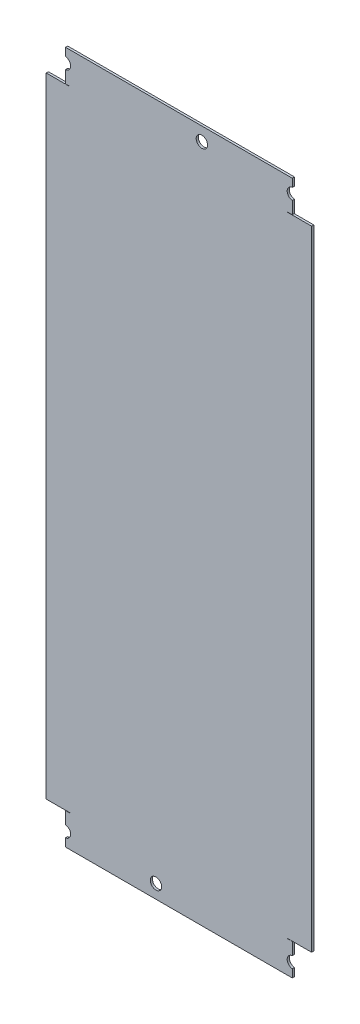
ISO-10303-21;
HEADER;
FILE_DESCRIPTION(('STEP AP214'),'2;1');
FILE_NAME('part.step','',(''),(''),'','','');
FILE_SCHEMA(('AUTOMOTIVE_DESIGN { 1 0 10303 214 1 1 1 1 }'));
ENDSEC;
DATA;
#1=APPLICATION_CONTEXT('core data for automotive mechanical design processes');
#2=APPLICATION_PROTOCOL_DEFINITION('international standard','automotive_design',2000,#1);
#3=PRODUCT_CONTEXT('',#1,'mechanical');
#4=PRODUCT('Part','Part','',(#3));
#5=PRODUCT_RELATED_PRODUCT_CATEGORY('part','',(#4));
#6=PRODUCT_DEFINITION_FORMATION('','',#4);
#7=PRODUCT_DEFINITION_CONTEXT('part definition',#1,'design');
#8=PRODUCT_DEFINITION('design','',#6,#7);
#9=PRODUCT_DEFINITION_SHAPE('','',#8);
#10=(LENGTH_UNIT() NAMED_UNIT(*) SI_UNIT(.MILLI.,.METRE.));
#11=(NAMED_UNIT(*) PLANE_ANGLE_UNIT() SI_UNIT($,.RADIAN.));
#12=(NAMED_UNIT(*) SI_UNIT($,.STERADIAN.) SOLID_ANGLE_UNIT());
#13=UNCERTAINTY_MEASURE_WITH_UNIT(LENGTH_MEASURE(1.E-05),#10,'distance_accuracy_value','');
#14=(GEOMETRIC_REPRESENTATION_CONTEXT(3) GLOBAL_UNCERTAINTY_ASSIGNED_CONTEXT((#13)) GLOBAL_UNIT_ASSIGNED_CONTEXT((#10,
#11,#12)) REPRESENTATION_CONTEXT('',''));
#15=CARTESIAN_POINT('',(0.,0.,0.));
#16=DIRECTION('',(0.,0.,1.));
#17=DIRECTION('',(1.,0.,0.));
#18=AXIS2_PLACEMENT_3D('',#15,#16,#17);
#19=CARTESIAN_POINT('',(0.,0.,-1.524));
#20=DIRECTION('',(0.,0.,-1.));
#21=DIRECTION('',(-1.,0.,0.));
#22=AXIS2_PLACEMENT_3D('',#19,#20,#21);
#23=PLANE('',#22);
#24=CARTESIAN_POINT('',(-16.002,-231.775,-1.524));
#25=DIRECTION('',(0.,0.,1.));
#26=DIRECTION('',(1.,0.,0.));
#27=AXIS2_PLACEMENT_3D('',#24,#25,#26);
#28=CIRCLE('',#27,3.96240000000002);
#29=CARTESIAN_POINT('',(-12.0396,-231.775,-1.524));
#30=VERTEX_POINT('',#29);
#31=EDGE_CURVE('E507',#30,#30,#28,.T.);
#32=ORIENTED_EDGE('',*,*,#31,.T.);
#33=EDGE_LOOP('',(#32));
#34=FACE_BOUND('',#33,.T.);
#35=CARTESIAN_POINT('',(16.002,231.775,-1.524));
#36=DIRECTION('',(0.,0.,1.));
#37=DIRECTION('',(1.,0.,0.));
#38=AXIS2_PLACEMENT_3D('',#35,#36,#37);
#39=CIRCLE('',#38,3.96240000000002);
#40=CARTESIAN_POINT('',(19.9644,231.775,-1.524));
#41=VERTEX_POINT('',#40);
#42=EDGE_CURVE('E515',#41,#41,#39,.T.);
#43=ORIENTED_EDGE('',*,*,#42,.T.);
#44=EDGE_LOOP('',(#43));
#45=FACE_BOUND('',#44,.T.);
#46=DIRECTION('',(0.,1.,0.));
#47=VECTOR('',#46,1.);
#48=CARTESIAN_POINT('',(78.994,-241.3,-1.524));
#49=LINE('',#48,#47);
#50=CARTESIAN_POINT('',(78.994,235.716503875426,-1.52400000000055));
#51=VERTEX_POINT('',#50);
#52=CARTESIAN_POINT('',(78.994,241.3,-1.524));
#53=VERTEX_POINT('',#52);
#54=EDGE_CURVE('E529',#51,#53,#49,.T.);
#55=ORIENTED_EDGE('',*,*,#54,.F.);
#56=CARTESIAN_POINT('',(79.4004,231.775,-1.52400000000055));
#57=DIRECTION('',(0.,0.,1.));
#58=DIRECTION('',(1.,0.,0.));
#59=AXIS2_PLACEMENT_3D('',#56,#57,#58);
#60=CIRCLE('',#59,3.96240000000001);
#61=CARTESIAN_POINT('',(78.994,227.833496124574,-1.52400000000055));
#62=VERTEX_POINT('',#61);
#63=EDGE_CURVE('E357',#62,#51,#60,.F.);
#64=ORIENTED_EDGE('',*,*,#63,.F.);
#65=CARTESIAN_POINT('',(78.994,219.2274,-1.524));
#66=VERTEX_POINT('',#65);
#67=EDGE_CURVE('E530',#66,#62,#49,.T.);
#68=ORIENTED_EDGE('',*,*,#67,.F.);
#69=DIRECTION('',(-1.,0.,0.));
#70=VECTOR('',#69,1.);
#71=CARTESIAN_POINT('',(0.,219.2274,-1.524));
#72=LINE('',#71,#70);
#73=CARTESIAN_POINT('',(75.7936,219.2274,-1.524));
#74=VERTEX_POINT('',#73);
#75=EDGE_CURVE('E503',#66,#74,#72,.T.);
#76=ORIENTED_EDGE('',*,*,#75,.T.);
#77=DIRECTION('',(0.,-1.,0.));
#78=VECTOR('',#77,1.);
#79=CARTESIAN_POINT('',(75.7936,0.,-1.524));
#80=LINE('',#79,#78);
#81=CARTESIAN_POINT('',(75.7936,219.075,-1.524));
#82=VERTEX_POINT('',#81);
#83=EDGE_CURVE('E500',#74,#82,#80,.T.);
#84=ORIENTED_EDGE('',*,*,#83,.T.);
#85=DIRECTION('',(1.,0.,0.));
#86=VECTOR('',#85,1.);
#87=CARTESIAN_POINT('',(0.,219.075,-1.524));
#88=LINE('',#87,#86);
#89=CARTESIAN_POINT('',(92.4429625310124,219.075,-1.52400000000012));
#90=VERTEX_POINT('',#89);
#91=EDGE_CURVE('E497',#82,#90,#88,.T.);
#92=ORIENTED_EDGE('',*,*,#91,.T.);
#93=DIRECTION('',(0.,-1.,0.));
#94=VECTOR('',#93,1.);
#95=CARTESIAN_POINT('',(92.4429625310124,0.,-1.52400000000011));
#96=LINE('',#95,#94);
#97=CARTESIAN_POINT('',(92.4429625310124,-219.075,-1.52400000000009));
#98=VERTEX_POINT('',#97);
#99=EDGE_CURVE('E301',#90,#98,#96,.T.);
#100=ORIENTED_EDGE('',*,*,#99,.T.);
#101=DIRECTION('',(-1.,0.,0.));
#102=VECTOR('',#101,1.);
#103=CARTESIAN_POINT('',(0.,-219.075,-1.524));
#104=LINE('',#103,#102);
#105=CARTESIAN_POINT('',(75.7936,-219.075,-1.524));
#106=VERTEX_POINT('',#105);
#107=EDGE_CURVE('E494',#98,#106,#104,.T.);
#108=ORIENTED_EDGE('',*,*,#107,.T.);
#109=DIRECTION('',(0.,-1.,0.));
#110=VECTOR('',#109,1.);
#111=CARTESIAN_POINT('',(75.7936,0.,-1.524));
#112=LINE('',#111,#110);
#113=CARTESIAN_POINT('',(75.7936,-219.2274,-1.524));
#114=VERTEX_POINT('',#113);
#115=EDGE_CURVE('E491',#106,#114,#112,.T.);
#116=ORIENTED_EDGE('',*,*,#115,.T.);
#117=DIRECTION('',(1.,0.,0.));
#118=VECTOR('',#117,1.);
#119=CARTESIAN_POINT('',(0.,-219.2274,-1.524));
#120=LINE('',#119,#118);
#121=CARTESIAN_POINT('',(78.994,-219.2274,-1.524));
#122=VERTEX_POINT('',#121);
#123=EDGE_CURVE('E455',#114,#122,#120,.T.);
#124=ORIENTED_EDGE('',*,*,#123,.T.);
#125=CARTESIAN_POINT('',(78.994,-227.833496124574,-1.52400000000055));
#126=VERTEX_POINT('',#125);
#127=EDGE_CURVE('E528',#126,#122,#49,.T.);
#128=ORIENTED_EDGE('',*,*,#127,.F.);
#129=CARTESIAN_POINT('',(79.4004000000001,-231.775,-1.52400000000055));
#130=DIRECTION('',(0.,0.,1.));
#131=DIRECTION('',(1.,0.,0.));
#132=AXIS2_PLACEMENT_3D('',#129,#130,#131);
#133=CIRCLE('',#132,3.96240000000001);
#134=CARTESIAN_POINT('',(78.994,-235.716503875426,-1.52400000000055));
#135=VERTEX_POINT('',#134);
#136=EDGE_CURVE('E343',#135,#126,#133,.F.);
#137=ORIENTED_EDGE('',*,*,#136,.F.);
#138=CARTESIAN_POINT('',(78.994,-241.3,-1.524));
#139=VERTEX_POINT('',#138);
#140=EDGE_CURVE('E523',#139,#135,#49,.T.);
#141=ORIENTED_EDGE('',*,*,#140,.F.);
#142=DIRECTION('',(1.,0.,0.));
#143=VECTOR('',#142,1.);
#144=CARTESIAN_POINT('',(-78.994,-241.3,-1.524));
#145=LINE('',#144,#143);
#146=CARTESIAN_POINT('',(-78.994,-241.3,-1.524));
#147=VERTEX_POINT('',#146);
#148=EDGE_CURVE('E539',#147,#139,#145,.T.);
#149=ORIENTED_EDGE('',*,*,#148,.F.);
#150=DIRECTION('',(0.,-1.,0.));
#151=VECTOR('',#150,1.);
#152=CARTESIAN_POINT('',(-78.994,-241.3,-1.524));
#153=LINE('',#152,#151);
#154=CARTESIAN_POINT('',(-78.994,-235.716503875426,-1.52400000000055));
#155=VERTEX_POINT('',#154);
#156=EDGE_CURVE('E534',#155,#147,#153,.T.);
#157=ORIENTED_EDGE('',*,*,#156,.F.);
#158=CARTESIAN_POINT('',(-79.4004,-231.775,-1.52400000000055));
#159=DIRECTION('',(0.,0.,1.));
#160=DIRECTION('',(1.,0.,0.));
#161=AXIS2_PLACEMENT_3D('',#158,#159,#160);
#162=CIRCLE('',#161,3.96240000000001);
#163=CARTESIAN_POINT('',(-78.994,-227.833496124574,-1.52400000000055));
#164=VERTEX_POINT('',#163);
#165=EDGE_CURVE('E330',#155,#164,#162,.T.);
#166=ORIENTED_EDGE('',*,*,#165,.T.);
#167=CARTESIAN_POINT('',(-78.994,-219.2274,-1.524));
#168=VERTEX_POINT('',#167);
#169=EDGE_CURVE('E541',#168,#164,#153,.T.);
#170=ORIENTED_EDGE('',*,*,#169,.F.);
#171=DIRECTION('',(1.,0.,0.));
#172=VECTOR('',#171,1.);
#173=CARTESIAN_POINT('',(0.,-219.2274,-1.524));
#174=LINE('',#173,#172);
#175=CARTESIAN_POINT('',(-75.7936,-219.2274,-1.524));
#176=VERTEX_POINT('',#175);
#177=EDGE_CURVE('E431',#168,#176,#174,.T.);
#178=ORIENTED_EDGE('',*,*,#177,.T.);
#179=DIRECTION('',(0.,1.,0.));
#180=VECTOR('',#179,1.);
#181=CARTESIAN_POINT('',(-75.7936,0.,-1.524));
#182=LINE('',#181,#180);
#183=CARTESIAN_POINT('',(-75.7936,-219.075,-1.524));
#184=VERTEX_POINT('',#183);
#185=EDGE_CURVE('E446',#176,#184,#182,.T.);
#186=ORIENTED_EDGE('',*,*,#185,.T.);
#187=DIRECTION('',(-1.,0.,0.));
#188=VECTOR('',#187,1.);
#189=CARTESIAN_POINT('',(0.,-219.075,-1.524));
#190=LINE('',#189,#188);
#191=CARTESIAN_POINT('',(-92.442962531013,-219.075,-1.52400000000066));
#192=VERTEX_POINT('',#191);
#193=EDGE_CURVE('E443',#184,#192,#190,.T.);
#194=ORIENTED_EDGE('',*,*,#193,.T.);
#195=DIRECTION('',(0.,1.,0.));
#196=VECTOR('',#195,1.);
#197=CARTESIAN_POINT('',(-92.442962531013,0.,-1.52400000000066));
#198=LINE('',#197,#196);
#199=CARTESIAN_POINT('',(-92.442962531013,219.075,-1.52400000000066));
#200=VERTEX_POINT('',#199);
#201=EDGE_CURVE('E317',#192,#200,#198,.T.);
#202=ORIENTED_EDGE('',*,*,#201,.T.);
#203=DIRECTION('',(1.,0.,0.));
#204=VECTOR('',#203,1.);
#205=CARTESIAN_POINT('',(0.,219.075,-1.524));
#206=LINE('',#205,#204);
#207=CARTESIAN_POINT('',(-75.7936,219.075,-1.524));
#208=VERTEX_POINT('',#207);
#209=EDGE_CURVE('E439',#200,#208,#206,.T.);
#210=ORIENTED_EDGE('',*,*,#209,.T.);
#211=DIRECTION('',(0.,1.,0.));
#212=VECTOR('',#211,1.);
#213=CARTESIAN_POINT('',(-75.7936,0.,-1.524));
#214=LINE('',#213,#212);
#215=CARTESIAN_POINT('',(-75.7936,219.2274,-1.524));
#216=VERTEX_POINT('',#215);
#217=EDGE_CURVE('E435',#208,#216,#214,.T.);
#218=ORIENTED_EDGE('',*,*,#217,.T.);
#219=DIRECTION('',(-1.,0.,0.));
#220=VECTOR('',#219,1.);
#221=CARTESIAN_POINT('',(0.,219.2274,-1.524));
#222=LINE('',#221,#220);
#223=CARTESIAN_POINT('',(-78.994,219.2274,-1.524));
#224=VERTEX_POINT('',#223);
#225=EDGE_CURVE('E385',#216,#224,#222,.T.);
#226=ORIENTED_EDGE('',*,*,#225,.T.);
#227=CARTESIAN_POINT('',(-78.994,227.833496124574,-1.52400000000055));
#228=VERTEX_POINT('',#227);
#229=EDGE_CURVE('E540',#228,#224,#153,.T.);
#230=ORIENTED_EDGE('',*,*,#229,.F.);
#231=CARTESIAN_POINT('',(-79.4004,231.775,-1.52400000000055));
#232=DIRECTION('',(0.,0.,1.));
#233=DIRECTION('',(1.,0.,0.));
#234=AXIS2_PLACEMENT_3D('',#231,#232,#233);
#235=CIRCLE('',#234,3.96240000000001);
#236=CARTESIAN_POINT('',(-78.994,235.716503875426,-1.52400000000055));
#237=VERTEX_POINT('',#236);
#238=EDGE_CURVE('E368',#228,#237,#235,.T.);
#239=ORIENTED_EDGE('',*,*,#238,.T.);
#240=CARTESIAN_POINT('',(-78.994,241.3,-1.524));
#241=VERTEX_POINT('',#240);
#242=EDGE_CURVE('E535',#241,#237,#153,.T.);
#243=ORIENTED_EDGE('',*,*,#242,.F.);
#244=DIRECTION('',(-1.,0.,0.));
#245=VECTOR('',#244,1.);
#246=CARTESIAN_POINT('',(-78.994,241.3,-1.524));
#247=LINE('',#246,#245);
#248=EDGE_CURVE('E527',#53,#241,#247,.T.);
#249=ORIENTED_EDGE('',*,*,#248,.F.);
#250=EDGE_LOOP('',(#55,#64,#68,#76,#84,#92,#100,#108,#116,#124,#128,#137,#141,#149,#157,#166,
#170,#178,#186,#194,#202,#210,#218,#226,#230,#239,#243,#249));
#251=FACE_BOUND('',#250,.T.);
#252=ADVANCED_FACE('F93',(#34,#45,#251),#23,.T.);
#253=CARTESIAN_POINT('',(0.,0.,0.));
#254=DIRECTION('',(0.,0.,-1.));
#255=DIRECTION('',(-1.,0.,0.));
#256=AXIS2_PLACEMENT_3D('',#253,#254,#255);
#257=PLANE('',#256);
#258=CARTESIAN_POINT('',(-16.002,-231.775,0.));
#259=DIRECTION('',(0.,0.,1.));
#260=DIRECTION('',(1.,0.,0.));
#261=AXIS2_PLACEMENT_3D('',#258,#259,#260);
#262=CIRCLE('',#261,3.96240000000002);
#263=CARTESIAN_POINT('',(-12.0396,-231.775,0.));
#264=VERTEX_POINT('',#263);
#265=EDGE_CURVE('E506',#264,#264,#262,.T.);
#266=ORIENTED_EDGE('',*,*,#265,.F.);
#267=EDGE_LOOP('',(#266));
#268=FACE_BOUND('',#267,.T.);
#269=CARTESIAN_POINT('',(16.002,231.775,0.));
#270=DIRECTION('',(0.,0.,1.));
#271=DIRECTION('',(1.,0.,0.));
#272=AXIS2_PLACEMENT_3D('',#269,#270,#271);
#273=CIRCLE('',#272,3.96240000000002);
#274=CARTESIAN_POINT('',(19.9644,231.775,0.));
#275=VERTEX_POINT('',#274);
#276=EDGE_CURVE('E511',#275,#275,#273,.T.);
#277=ORIENTED_EDGE('',*,*,#276,.F.);
#278=EDGE_LOOP('',(#277));
#279=FACE_BOUND('',#278,.T.);
#280=CARTESIAN_POINT('',(79.4004,231.775,0.));
#281=DIRECTION('',(0.,0.,1.));
#282=DIRECTION('',(1.,0.,0.));
#283=AXIS2_PLACEMENT_3D('',#280,#281,#282);
#284=CIRCLE('',#283,3.96240000000001);
#285=CARTESIAN_POINT('',(78.994,227.833496124574,0.));
#286=VERTEX_POINT('',#285);
#287=CARTESIAN_POINT('',(78.994,235.716503875426,0.));
#288=VERTEX_POINT('',#287);
#289=EDGE_CURVE('E316',#286,#288,#284,.F.);
#290=ORIENTED_EDGE('',*,*,#289,.T.);
#291=DIRECTION('',(0.,1.,0.));
#292=VECTOR('',#291,1.);
#293=CARTESIAN_POINT('',(78.994,-241.3,0.));
#294=LINE('',#293,#292);
#295=CARTESIAN_POINT('',(78.994,241.3,0.));
#296=VERTEX_POINT('',#295);
#297=EDGE_CURVE('E519',#288,#296,#294,.T.);
#298=ORIENTED_EDGE('',*,*,#297,.T.);
#299=DIRECTION('',(-1.,0.,0.));
#300=VECTOR('',#299,1.);
#301=CARTESIAN_POINT('',(-78.994,241.3,0.));
#302=LINE('',#301,#300);
#303=CARTESIAN_POINT('',(-78.994,241.3,0.));
#304=VERTEX_POINT('',#303);
#305=EDGE_CURVE('E549',#296,#304,#302,.T.);
#306=ORIENTED_EDGE('',*,*,#305,.T.);
#307=DIRECTION('',(0.,-1.,0.));
#308=VECTOR('',#307,1.);
#309=CARTESIAN_POINT('',(-78.994,-241.3,0.));
#310=LINE('',#309,#308);
#311=CARTESIAN_POINT('',(-78.994,235.716503875426,0.));
#312=VERTEX_POINT('',#311);
#313=EDGE_CURVE('E556',#304,#312,#310,.T.);
#314=ORIENTED_EDGE('',*,*,#313,.T.);
#315=CARTESIAN_POINT('',(-79.4004,231.775,0.));
#316=DIRECTION('',(0.,0.,1.));
#317=DIRECTION('',(1.,0.,0.));
#318=AXIS2_PLACEMENT_3D('',#315,#316,#317);
#319=CIRCLE('',#318,3.96240000000001);
#320=CARTESIAN_POINT('',(-78.994,227.833496124574,0.));
#321=VERTEX_POINT('',#320);
#322=EDGE_CURVE('E119',#321,#312,#319,.T.);
#323=ORIENTED_EDGE('',*,*,#322,.F.);
#324=CARTESIAN_POINT('',(-78.994,219.2274,0.));
#325=VERTEX_POINT('',#324);
#326=EDGE_CURVE('E561',#321,#325,#310,.T.);
#327=ORIENTED_EDGE('',*,*,#326,.T.);
#328=DIRECTION('',(-1.,0.,0.));
#329=VECTOR('',#328,1.);
#330=CARTESIAN_POINT('',(-75.7936,219.2274,-5.49039980146659E-13));
#331=LINE('',#330,#329);
#332=CARTESIAN_POINT('',(-75.7936,219.2274,-5.49039980146659E-13));
#333=VERTEX_POINT('',#332);
#334=EDGE_CURVE('E405',#333,#325,#331,.T.);
#335=ORIENTED_EDGE('',*,*,#334,.F.);
#336=DIRECTION('',(0.,1.,0.));
#337=VECTOR('',#336,1.);
#338=CARTESIAN_POINT('',(-75.7936,219.075,-5.49039980146659E-13));
#339=LINE('',#338,#337);
#340=CARTESIAN_POINT('',(-75.7936,219.075,-5.49039980146659E-13));
#341=VERTEX_POINT('',#340);
#342=EDGE_CURVE('E400',#341,#333,#339,.T.);
#343=ORIENTED_EDGE('',*,*,#342,.F.);
#344=DIRECTION('',(1.,0.,0.));
#345=VECTOR('',#344,1.);
#346=CARTESIAN_POINT('',(-75.946,219.075,-5.49039980146659E-13));
#347=LINE('',#346,#345);
#348=CARTESIAN_POINT('',(-92.442962531013,219.075,-6.66133814775094E-13));
#349=VERTEX_POINT('',#348);
#350=EDGE_CURVE('E396',#349,#341,#347,.T.);
#351=ORIENTED_EDGE('',*,*,#350,.F.);
#352=DIRECTION('',(0.,-1.,0.));
#353=VECTOR('',#352,1.);
#354=CARTESIAN_POINT('',(-92.442962531013,219.075,-6.66133814775094E-13));
#355=LINE('',#354,#353);
#356=CARTESIAN_POINT('',(-92.442962531013,-219.075,-6.66133814775094E-13));
#357=VERTEX_POINT('',#356);
#358=EDGE_CURVE('E325',#357,#349,#355,.F.);
#359=ORIENTED_EDGE('',*,*,#358,.F.);
#360=DIRECTION('',(-1.,0.,0.));
#361=VECTOR('',#360,1.);
#362=CARTESIAN_POINT('',(-75.7936,-219.075,-5.49039980146659E-13));
#363=LINE('',#362,#361);
#364=CARTESIAN_POINT('',(-75.7936,-219.075,-5.49039980146659E-13));
#365=VERTEX_POINT('',#364);
#366=EDGE_CURVE('E392',#365,#357,#363,.T.);
#367=ORIENTED_EDGE('',*,*,#366,.F.);
#368=DIRECTION('',(0.,1.,0.));
#369=VECTOR('',#368,1.);
#370=CARTESIAN_POINT('',(-75.7936,-219.2274,-5.49039980146659E-13));
#371=LINE('',#370,#369);
#372=CARTESIAN_POINT('',(-75.7936,-219.2274,-5.49039980146659E-13));
#373=VERTEX_POINT('',#372);
#374=EDGE_CURVE('E387',#373,#365,#371,.T.);
#375=ORIENTED_EDGE('',*,*,#374,.F.);
#376=DIRECTION('',(1.,0.,0.));
#377=VECTOR('',#376,1.);
#378=CARTESIAN_POINT('',(-78.994,-219.2274,-2.7451999007333E-13));
#379=LINE('',#378,#377);
#380=CARTESIAN_POINT('',(-78.994,-219.2274,-2.7451999007333E-13));
#381=VERTEX_POINT('',#380);
#382=EDGE_CURVE('E381',#381,#373,#379,.T.);
#383=ORIENTED_EDGE('',*,*,#382,.F.);
#384=CARTESIAN_POINT('',(-78.994,-227.833496124574,0.));
#385=VERTEX_POINT('',#384);
#386=EDGE_CURVE('E562',#381,#385,#310,.T.);
#387=ORIENTED_EDGE('',*,*,#386,.T.);
#388=CARTESIAN_POINT('',(-79.4004,-231.775,0.));
#389=DIRECTION('',(0.,0.,1.));
#390=DIRECTION('',(1.,0.,0.));
#391=AXIS2_PLACEMENT_3D('',#388,#389,#390);
#392=CIRCLE('',#391,3.96240000000001);
#393=CARTESIAN_POINT('',(-78.994,-235.716503875426,0.));
#394=VERTEX_POINT('',#393);
#395=EDGE_CURVE('E111',#394,#385,#392,.T.);
#396=ORIENTED_EDGE('',*,*,#395,.F.);
#397=CARTESIAN_POINT('',(-78.994,-241.3,0.));
#398=VERTEX_POINT('',#397);
#399=EDGE_CURVE('E555',#394,#398,#310,.T.);
#400=ORIENTED_EDGE('',*,*,#399,.T.);
#401=DIRECTION('',(1.,0.,0.));
#402=VECTOR('',#401,1.);
#403=CARTESIAN_POINT('',(-78.994,-241.3,0.));
#404=LINE('',#403,#402);
#405=CARTESIAN_POINT('',(78.994,-241.3,0.));
#406=VERTEX_POINT('',#405);
#407=EDGE_CURVE('E560',#398,#406,#404,.T.);
#408=ORIENTED_EDGE('',*,*,#407,.T.);
#409=CARTESIAN_POINT('',(78.994,-235.716503875426,0.));
#410=VERTEX_POINT('',#409);
#411=EDGE_CURVE('E545',#406,#410,#294,.T.);
#412=ORIENTED_EDGE('',*,*,#411,.T.);
#413=CARTESIAN_POINT('',(79.4004000000001,-231.775,0.));
#414=DIRECTION('',(0.,0.,1.));
#415=DIRECTION('',(1.,0.,0.));
#416=AXIS2_PLACEMENT_3D('',#413,#414,#415);
#417=CIRCLE('',#416,3.96240000000001);
#418=CARTESIAN_POINT('',(78.994,-227.833496124574,0.));
#419=VERTEX_POINT('',#418);
#420=EDGE_CURVE('E347',#410,#419,#417,.F.);
#421=ORIENTED_EDGE('',*,*,#420,.T.);
#422=CARTESIAN_POINT('',(78.994,-219.2274,0.));
#423=VERTEX_POINT('',#422);
#424=EDGE_CURVE('E550',#419,#423,#294,.T.);
#425=ORIENTED_EDGE('',*,*,#424,.T.);
#426=DIRECTION('',(1.,0.,0.));
#427=VECTOR('',#426,1.);
#428=CARTESIAN_POINT('',(75.7936,-219.2274,0.));
#429=LINE('',#428,#427);
#430=CARTESIAN_POINT('',(75.7936,-219.2274,0.));
#431=VERTEX_POINT('',#430);
#432=EDGE_CURVE('E467',#431,#423,#429,.T.);
#433=ORIENTED_EDGE('',*,*,#432,.F.);
#434=DIRECTION('',(0.,-1.,0.));
#435=VECTOR('',#434,1.);
#436=CARTESIAN_POINT('',(75.7936,-219.075,0.));
#437=LINE('',#436,#435);
#438=CARTESIAN_POINT('',(75.7936,-219.075,0.));
#439=VERTEX_POINT('',#438);
#440=EDGE_CURVE('E462',#439,#431,#437,.T.);
#441=ORIENTED_EDGE('',*,*,#440,.F.);
#442=DIRECTION('',(-1.,0.,0.));
#443=VECTOR('',#442,1.);
#444=CARTESIAN_POINT('',(75.946,-219.075,0.));
#445=LINE('',#444,#443);
#446=CARTESIAN_POINT('',(92.4429625310124,-219.075,0.));
#447=VERTEX_POINT('',#446);
#448=EDGE_CURVE('E306',#447,#439,#445,.T.);
#449=ORIENTED_EDGE('',*,*,#448,.F.);
#450=DIRECTION('',(0.,1.,0.));
#451=VECTOR('',#450,1.);
#452=CARTESIAN_POINT('',(92.4429625310124,-219.075,0.));
#453=LINE('',#452,#451);
#454=CARTESIAN_POINT('',(92.4429625310124,219.075,-1.2490009027033E-13));
#455=VERTEX_POINT('',#454);
#456=EDGE_CURVE('E298',#455,#447,#453,.F.);
#457=ORIENTED_EDGE('',*,*,#456,.F.);
#458=DIRECTION('',(1.,0.,0.));
#459=VECTOR('',#458,1.);
#460=CARTESIAN_POINT('',(75.7936,219.075,0.));
#461=LINE('',#460,#459);
#462=CARTESIAN_POINT('',(75.7936,219.075,0.));
#463=VERTEX_POINT('',#462);
#464=EDGE_CURVE('E280',#463,#455,#461,.T.);
#465=ORIENTED_EDGE('',*,*,#464,.F.);
#466=DIRECTION('',(0.,-1.,0.));
#467=VECTOR('',#466,1.);
#468=CARTESIAN_POINT('',(75.7936,219.2274,0.));
#469=LINE('',#468,#467);
#470=CARTESIAN_POINT('',(75.7936,219.2274,0.));
#471=VERTEX_POINT('',#470);
#472=EDGE_CURVE('E457',#471,#463,#469,.T.);
#473=ORIENTED_EDGE('',*,*,#472,.F.);
#474=DIRECTION('',(-1.,0.,0.));
#475=VECTOR('',#474,1.);
#476=CARTESIAN_POINT('',(78.994,219.2274,0.));
#477=LINE('',#476,#475);
#478=CARTESIAN_POINT('',(78.994,219.2274,0.));
#479=VERTEX_POINT('',#478);
#480=EDGE_CURVE('E451',#479,#471,#477,.T.);
#481=ORIENTED_EDGE('',*,*,#480,.F.);
#482=EDGE_CURVE('E551',#479,#286,#294,.T.);
#483=ORIENTED_EDGE('',*,*,#482,.T.);
#484=EDGE_LOOP('',(#290,#298,#306,#314,#323,#327,#335,#343,#351,#359,#367,#375,#383,#387,#396,
#400,#408,#412,#421,#425,#433,#441,#449,#457,#465,#473,#481,#483));
#485=FACE_BOUND('',#484,.T.);
#486=ADVANCED_FACE('F95',(#268,#279,#485),#257,.F.);
#487=CARTESIAN_POINT('',(-78.994,-241.3,-1.524));
#488=DIRECTION('',(-1.,0.,0.));
#489=DIRECTION('',(0.,0.,1.));
#490=AXIS2_PLACEMENT_3D('',#487,#488,#489);
#491=PLANE('',#490);
#492=DIRECTION('',(0.,0.,1.));
#493=VECTOR('',#492,1.);
#494=CARTESIAN_POINT('',(-78.994,-235.716503875426,-1.52400000000055));
#495=LINE('',#494,#493);
#496=EDGE_CURVE('E334',#155,#394,#495,.T.);
#497=ORIENTED_EDGE('',*,*,#496,.F.);
#498=ORIENTED_EDGE('',*,*,#156,.T.);
#499=DIRECTION('',(0.,0.,1.));
#500=VECTOR('',#499,1.);
#501=CARTESIAN_POINT('',(-78.994,-241.3,-1.524));
#502=LINE('',#501,#500);
#503=EDGE_CURVE('E103',#147,#398,#502,.T.);
#504=ORIENTED_EDGE('',*,*,#503,.T.);
#505=ORIENTED_EDGE('',*,*,#399,.F.);
#506=EDGE_LOOP('',(#497,#498,#504,#505));
#507=FACE_BOUND('',#506,.T.);
#508=ADVANCED_FACE('F648',(#507),#491,.T.);
#509=DIRECTION('',(0.,0.,1.));
#510=VECTOR('',#509,1.);
#511=CARTESIAN_POINT('',(-78.994,227.833496124574,-1.52400000000055));
#512=LINE('',#511,#510);
#513=EDGE_CURVE('E372',#228,#321,#512,.T.);
#514=ORIENTED_EDGE('',*,*,#513,.F.);
#515=ORIENTED_EDGE('',*,*,#229,.T.);
#516=DIRECTION('',(0.,0.,-1.));
#517=VECTOR('',#516,1.);
#518=CARTESIAN_POINT('',(-78.994,219.2274,-2.7451999007333E-13));
#519=LINE('',#518,#517);
#520=EDGE_CURVE('E409',#325,#224,#519,.T.);
#521=ORIENTED_EDGE('',*,*,#520,.F.);
#522=ORIENTED_EDGE('',*,*,#326,.F.);
#523=EDGE_LOOP('',(#514,#515,#521,#522));
#524=FACE_BOUND('',#523,.T.);
#525=ADVANCED_FACE('F671',(#524),#491,.T.);
#526=CARTESIAN_POINT('',(78.994,-241.3,-1.524));
#527=DIRECTION('',(1.,0.,0.));
#528=DIRECTION('',(0.,0.,-1.));
#529=AXIS2_PLACEMENT_3D('',#526,#527,#528);
#530=PLANE('',#529);
#531=ORIENTED_EDGE('',*,*,#297,.F.);
#532=DIRECTION('',(0.,0.,1.));
#533=VECTOR('',#532,1.);
#534=CARTESIAN_POINT('',(78.994,235.716503875426,-1.52400000000055));
#535=LINE('',#534,#533);
#536=EDGE_CURVE('E351',#51,#288,#535,.T.);
#537=ORIENTED_EDGE('',*,*,#536,.F.);
#538=ORIENTED_EDGE('',*,*,#54,.T.);
#539=DIRECTION('',(0.,0.,1.));
#540=VECTOR('',#539,1.);
#541=CARTESIAN_POINT('',(78.994,241.3,-1.524));
#542=LINE('',#541,#540);
#543=EDGE_CURVE('E97',#53,#296,#542,.T.);
#544=ORIENTED_EDGE('',*,*,#543,.T.);
#545=EDGE_LOOP('',(#531,#537,#538,#544));
#546=FACE_BOUND('',#545,.T.);
#547=ADVANCED_FACE('F580',(#546),#530,.T.);
#548=ORIENTED_EDGE('',*,*,#67,.T.);
#549=DIRECTION('',(0.,0.,1.));
#550=VECTOR('',#549,1.);
#551=CARTESIAN_POINT('',(78.994,227.833496124574,-1.52400000000055));
#552=LINE('',#551,#550);
#553=EDGE_CURVE('E360',#62,#286,#552,.T.);
#554=ORIENTED_EDGE('',*,*,#553,.T.);
#555=ORIENTED_EDGE('',*,*,#482,.F.);
#556=DIRECTION('',(0.,0.,-1.));
#557=VECTOR('',#556,1.);
#558=CARTESIAN_POINT('',(78.994,219.2274,0.));
#559=LINE('',#558,#557);
#560=EDGE_CURVE('E456',#479,#66,#559,.T.);
#561=ORIENTED_EDGE('',*,*,#560,.T.);
#562=EDGE_LOOP('',(#548,#554,#555,#561));
#563=FACE_BOUND('',#562,.T.);
#564=ADVANCED_FACE('F622',(#563),#530,.T.);
#565=ORIENTED_EDGE('',*,*,#424,.F.);
#566=DIRECTION('',(0.,0.,1.));
#567=VECTOR('',#566,1.);
#568=CARTESIAN_POINT('',(78.994,-227.833496124574,-1.52400000000055));
#569=LINE('',#568,#567);
#570=EDGE_CURVE('E337',#126,#419,#569,.T.);
#571=ORIENTED_EDGE('',*,*,#570,.F.);
#572=ORIENTED_EDGE('',*,*,#127,.T.);
#573=DIRECTION('',(0.,0.,-1.));
#574=VECTOR('',#573,1.);
#575=CARTESIAN_POINT('',(78.994,-219.2274,0.));
#576=LINE('',#575,#574);
#577=EDGE_CURVE('E471',#423,#122,#576,.T.);
#578=ORIENTED_EDGE('',*,*,#577,.F.);
#579=EDGE_LOOP('',(#565,#571,#572,#578));
#580=FACE_BOUND('',#579,.T.);
#581=ADVANCED_FACE('F596',(#580),#530,.T.);
#582=ORIENTED_EDGE('',*,*,#140,.T.);
#583=DIRECTION('',(0.,0.,1.));
#584=VECTOR('',#583,1.);
#585=CARTESIAN_POINT('',(78.994,-235.716503875426,-1.52400000000055));
#586=LINE('',#585,#584);
#587=EDGE_CURVE('E346',#135,#410,#586,.T.);
#588=ORIENTED_EDGE('',*,*,#587,.T.);
#589=ORIENTED_EDGE('',*,*,#411,.F.);
#590=DIRECTION('',(0.,0.,1.));
#591=VECTOR('',#590,1.);
#592=CARTESIAN_POINT('',(78.994,-241.3,-1.524));
#593=LINE('',#592,#591);
#594=EDGE_CURVE('E13',#139,#406,#593,.T.);
#595=ORIENTED_EDGE('',*,*,#594,.F.);
#596=EDGE_LOOP('',(#582,#588,#589,#595));
#597=FACE_BOUND('',#596,.T.);
#598=ADVANCED_FACE('F656',(#597),#530,.T.);
#599=DIRECTION('',(0.,0.,1.));
#600=VECTOR('',#599,1.);
#601=CARTESIAN_POINT('',(-78.994,-227.833496124574,-1.52400000000055));
#602=LINE('',#601,#600);
#603=EDGE_CURVE('E338',#164,#385,#602,.T.);
#604=ORIENTED_EDGE('',*,*,#603,.T.);
#605=ORIENTED_EDGE('',*,*,#386,.F.);
#606=DIRECTION('',(0.,0.,-1.));
#607=VECTOR('',#606,1.);
#608=CARTESIAN_POINT('',(-78.994,-219.2274,-2.7451999007333E-13));
#609=LINE('',#608,#607);
#610=EDGE_CURVE('E386',#381,#168,#609,.T.);
#611=ORIENTED_EDGE('',*,*,#610,.T.);
#612=ORIENTED_EDGE('',*,*,#169,.T.);
#613=EDGE_LOOP('',(#604,#605,#611,#612));
#614=FACE_BOUND('',#613,.T.);
#615=ADVANCED_FACE('F698',(#614),#491,.T.);
#616=DIRECTION('',(0.,0.,1.));
#617=VECTOR('',#616,1.);
#618=CARTESIAN_POINT('',(-78.994,235.716503875426,-1.52400000000055));
#619=LINE('',#618,#617);
#620=EDGE_CURVE('E375',#237,#312,#619,.T.);
#621=ORIENTED_EDGE('',*,*,#620,.T.);
#622=ORIENTED_EDGE('',*,*,#313,.F.);
#623=DIRECTION('',(0.,0.,1.));
#624=VECTOR('',#623,1.);
#625=CARTESIAN_POINT('',(-78.994,241.3,-1.524));
#626=LINE('',#625,#624);
#627=EDGE_CURVE('E568',#241,#304,#626,.T.);
#628=ORIENTED_EDGE('',*,*,#627,.F.);
#629=ORIENTED_EDGE('',*,*,#242,.T.);
#630=EDGE_LOOP('',(#621,#622,#628,#629));
#631=FACE_BOUND('',#630,.T.);
#632=ADVANCED_FACE('F725',(#631),#491,.T.);
#633=CARTESIAN_POINT('',(-78.994,-241.3,-1.524));
#634=DIRECTION('',(0.,-1.,0.));
#635=DIRECTION('',(0.,0.,-1.));
#636=AXIS2_PLACEMENT_3D('',#633,#634,#635);
#637=PLANE('',#636);
#638=ORIENTED_EDGE('',*,*,#407,.F.);
#639=ORIENTED_EDGE('',*,*,#503,.F.);
#640=ORIENTED_EDGE('',*,*,#148,.T.);
#641=ORIENTED_EDGE('',*,*,#594,.T.);
#642=EDGE_LOOP('',(#638,#639,#640,#641));
#643=FACE_BOUND('',#642,.T.);
#644=ADVANCED_FACE('F652',(#643),#637,.T.);
#645=CARTESIAN_POINT('',(-78.994,241.3,-1.524));
#646=DIRECTION('',(0.,1.,0.));
#647=DIRECTION('',(0.,0.,1.));
#648=AXIS2_PLACEMENT_3D('',#645,#646,#647);
#649=PLANE('',#648);
#650=ORIENTED_EDGE('',*,*,#305,.F.);
#651=ORIENTED_EDGE('',*,*,#543,.F.);
#652=ORIENTED_EDGE('',*,*,#248,.T.);
#653=ORIENTED_EDGE('',*,*,#627,.T.);
#654=EDGE_LOOP('',(#650,#651,#652,#653));
#655=FACE_BOUND('',#654,.T.);
#656=ADVANCED_FACE('F584',(#655),#649,.T.);
#657=CARTESIAN_POINT('',(16.002,231.775,-1.524));
#658=DIRECTION('',(0.,0.,1.));
#659=DIRECTION('',(1.,0.,0.));
#660=AXIS2_PLACEMENT_3D('',#657,#658,#659);
#661=CYLINDRICAL_SURFACE('',#660,3.96240000000002);
#662=CARTESIAN_POINT('',(19.9644,231.775,-1.524));
#663=CARTESIAN_POINT('',(19.9644,231.775,-1.508125));
#664=CARTESIAN_POINT('',(19.9644,231.775,-1.49225));
#665=CARTESIAN_POINT('',(19.9644,231.775,-1.4605));
#666=CARTESIAN_POINT('',(19.9644,231.775,-1.444625));
#667=CARTESIAN_POINT('',(19.9644,231.775,-1.412875));
#668=CARTESIAN_POINT('',(19.9644,231.775,-1.397));
#669=CARTESIAN_POINT('',(19.9644,231.775,-1.36525));
#670=CARTESIAN_POINT('',(19.9644,231.775,-1.349375));
#671=CARTESIAN_POINT('',(19.9644,231.775,-1.317625));
#672=CARTESIAN_POINT('',(19.9644,231.775,-1.30175));
#673=CARTESIAN_POINT('',(19.9644,231.775,-1.27));
#674=CARTESIAN_POINT('',(19.9644,231.775,-1.254125));
#675=CARTESIAN_POINT('',(19.9644,231.775,-1.222375));
#676=CARTESIAN_POINT('',(19.9644,231.775,-1.2065));
#677=CARTESIAN_POINT('',(19.9644,231.775,-1.17475));
#678=CARTESIAN_POINT('',(19.9644,231.775,-1.158875));
#679=CARTESIAN_POINT('',(19.9644,231.775,-1.127125));
#680=CARTESIAN_POINT('',(19.9644,231.775,-1.11125));
#681=CARTESIAN_POINT('',(19.9644,231.775,-1.0795));
#682=CARTESIAN_POINT('',(19.9644,231.775,-1.063625));
#683=CARTESIAN_POINT('',(19.9644,231.775,-1.031875));
#684=CARTESIAN_POINT('',(19.9644,231.775,-1.016));
#685=CARTESIAN_POINT('',(19.9644,231.775,-0.98425));
#686=CARTESIAN_POINT('',(19.9644,231.775,-0.968375));
#687=CARTESIAN_POINT('',(19.9644,231.775,-0.936625));
#688=CARTESIAN_POINT('',(19.9644,231.775,-0.92075));
#689=CARTESIAN_POINT('',(19.9644,231.775,-0.889));
#690=CARTESIAN_POINT('',(19.9644,231.775,-0.873125));
#691=CARTESIAN_POINT('',(19.9644,231.775,-0.841375));
#692=CARTESIAN_POINT('',(19.9644,231.775,-0.8255));
#693=CARTESIAN_POINT('',(19.9644,231.775,-0.79375));
#694=CARTESIAN_POINT('',(19.9644,231.775,-0.777875));
#695=CARTESIAN_POINT('',(19.9644,231.775,-0.746125));
#696=CARTESIAN_POINT('',(19.9644,231.775,-0.73025));
#697=CARTESIAN_POINT('',(19.9644,231.775,-0.6985));
#698=CARTESIAN_POINT('',(19.9644,231.775,-0.682625));
#699=CARTESIAN_POINT('',(19.9644,231.775,-0.650875));
#700=CARTESIAN_POINT('',(19.9644,231.775,-0.635));
#701=CARTESIAN_POINT('',(19.9644,231.775,-0.60325));
#702=CARTESIAN_POINT('',(19.9644,231.775,-0.587375));
#703=CARTESIAN_POINT('',(19.9644,231.775,-0.555625));
#704=CARTESIAN_POINT('',(19.9644,231.775,-0.53975));
#705=CARTESIAN_POINT('',(19.9644,231.775,-0.508));
#706=CARTESIAN_POINT('',(19.9644,231.775,-0.492125));
#707=CARTESIAN_POINT('',(19.9644,231.775,-0.460375));
#708=CARTESIAN_POINT('',(19.9644,231.775,-0.4445));
#709=CARTESIAN_POINT('',(19.9644,231.775,-0.41275));
#710=CARTESIAN_POINT('',(19.9644,231.775,-0.396875));
#711=CARTESIAN_POINT('',(19.9644,231.775,-0.365125));
#712=CARTESIAN_POINT('',(19.9644,231.775,-0.34925));
#713=CARTESIAN_POINT('',(19.9644,231.775,-0.3175));
#714=CARTESIAN_POINT('',(19.9644,231.775,-0.301625));
#715=CARTESIAN_POINT('',(19.9644,231.775,-0.269875));
#716=CARTESIAN_POINT('',(19.9644,231.775,-0.254));
#717=CARTESIAN_POINT('',(19.9644,231.775,-0.22225));
#718=CARTESIAN_POINT('',(19.9644,231.775,-0.206375));
#719=CARTESIAN_POINT('',(19.9644,231.775,-0.174625));
#720=CARTESIAN_POINT('',(19.9644,231.775,-0.15875));
#721=CARTESIAN_POINT('',(19.9644,231.775,-0.127));
#722=CARTESIAN_POINT('',(19.9644,231.775,-0.111125));
#723=CARTESIAN_POINT('',(19.9644,231.775,-0.079375));
#724=CARTESIAN_POINT('',(19.9644,231.775,-0.0635));
#725=CARTESIAN_POINT('',(19.9644,231.775,-0.0317499999999999));
#726=CARTESIAN_POINT('',(19.9644,231.775,-0.015875));
#727=CARTESIAN_POINT('',(19.9644,231.775,0.));
#728=B_SPLINE_CURVE_WITH_KNOTS('',3,(#662,#663,#664,#665,#666,#667,#668,#669,#670,#671,#672,
#673,#674,#675,#676,#677,#678,#679,#680,#681,#682,#683,#684,#685,#686,#687,#688,#689,#690,#691,
#692,#693,#694,#695,#696,#697,#698,#699,#700,#701,#702,#703,#704,#705,#706,#707,#708,#709,#710,
#711,#712,#713,#714,#715,#716,#717,#718,#719,#720,#721,#722,#723,#724,#725,#726,#727),
.UNSPECIFIED.,.F.,.F.,(4,2,2,2,2,2,2,2,2,2,2,2,2,2,2,2,2,2,2,2,2,2,2,2,2,2,2,2,2,2,2,2,4),(0.,
0.0476249999999999,0.0952499999999998,0.142875,0.1905,0.238125,0.28575,0.333375,0.381,0.428625,
0.47625,0.523875,0.5715,0.619125,0.66675,0.714375,0.762,0.809625,0.85725,0.904875,0.9525,
1.000125,1.04775,1.095375,1.143,1.190625,1.23825,1.285875,1.3335,1.381125,1.42875,1.476375,
1.524),.UNSPECIFIED.);
#729=EDGE_CURVE('BSEAM721',#41,#275,#728,.T.);
#730=ORIENTED_EDGE('',*,*,#42,.F.);
#731=ORIENTED_EDGE('',*,*,#276,.T.);
#732=ORIENTED_EDGE('',*,*,#729,.T.);
#733=ORIENTED_EDGE('',*,*,#729,.F.);
#734=EDGE_LOOP('',(#730,#732,#731,#733));
#735=FACE_BOUND('',#734,.T.);
#736=ADVANCED_FACE('F721',(#735),#661,.F.);
#737=CARTESIAN_POINT('',(-16.002,-231.775,-1.524));
#738=DIRECTION('',(0.,0.,1.));
#739=DIRECTION('',(1.,0.,0.));
#740=AXIS2_PLACEMENT_3D('',#737,#738,#739);
#741=CYLINDRICAL_SURFACE('',#740,3.96240000000002);
#742=CARTESIAN_POINT('',(-12.0396,-231.775,-1.524));
#743=CARTESIAN_POINT('',(-12.0396,-231.775,-1.508125));
#744=CARTESIAN_POINT('',(-12.0396,-231.775,-1.49225));
#745=CARTESIAN_POINT('',(-12.0396,-231.775,-1.4605));
#746=CARTESIAN_POINT('',(-12.0396,-231.775,-1.444625));
#747=CARTESIAN_POINT('',(-12.0396,-231.775,-1.412875));
#748=CARTESIAN_POINT('',(-12.0396,-231.775,-1.397));
#749=CARTESIAN_POINT('',(-12.0396,-231.775,-1.36525));
#750=CARTESIAN_POINT('',(-12.0396,-231.775,-1.349375));
#751=CARTESIAN_POINT('',(-12.0396,-231.775,-1.317625));
#752=CARTESIAN_POINT('',(-12.0396,-231.775,-1.30175));
#753=CARTESIAN_POINT('',(-12.0396,-231.775,-1.27));
#754=CARTESIAN_POINT('',(-12.0396,-231.775,-1.254125));
#755=CARTESIAN_POINT('',(-12.0396,-231.775,-1.222375));
#756=CARTESIAN_POINT('',(-12.0396,-231.775,-1.2065));
#757=CARTESIAN_POINT('',(-12.0396,-231.775,-1.17475));
#758=CARTESIAN_POINT('',(-12.0396,-231.775,-1.158875));
#759=CARTESIAN_POINT('',(-12.0396,-231.775,-1.127125));
#760=CARTESIAN_POINT('',(-12.0396,-231.775,-1.11125));
#761=CARTESIAN_POINT('',(-12.0396,-231.775,-1.0795));
#762=CARTESIAN_POINT('',(-12.0396,-231.775,-1.063625));
#763=CARTESIAN_POINT('',(-12.0396,-231.775,-1.031875));
#764=CARTESIAN_POINT('',(-12.0396,-231.775,-1.016));
#765=CARTESIAN_POINT('',(-12.0396,-231.775,-0.98425));
#766=CARTESIAN_POINT('',(-12.0396,-231.775,-0.968375));
#767=CARTESIAN_POINT('',(-12.0396,-231.775,-0.936625));
#768=CARTESIAN_POINT('',(-12.0396,-231.775,-0.92075));
#769=CARTESIAN_POINT('',(-12.0396,-231.775,-0.889));
#770=CARTESIAN_POINT('',(-12.0396,-231.775,-0.873125));
#771=CARTESIAN_POINT('',(-12.0396,-231.775,-0.841375));
#772=CARTESIAN_POINT('',(-12.0396,-231.775,-0.8255));
#773=CARTESIAN_POINT('',(-12.0396,-231.775,-0.79375));
#774=CARTESIAN_POINT('',(-12.0396,-231.775,-0.777875));
#775=CARTESIAN_POINT('',(-12.0396,-231.775,-0.746125));
#776=CARTESIAN_POINT('',(-12.0396,-231.775,-0.73025));
#777=CARTESIAN_POINT('',(-12.0396,-231.775,-0.6985));
#778=CARTESIAN_POINT('',(-12.0396,-231.775,-0.682625));
#779=CARTESIAN_POINT('',(-12.0396,-231.775,-0.650875));
#780=CARTESIAN_POINT('',(-12.0396,-231.775,-0.635));
#781=CARTESIAN_POINT('',(-12.0396,-231.775,-0.60325));
#782=CARTESIAN_POINT('',(-12.0396,-231.775,-0.587375));
#783=CARTESIAN_POINT('',(-12.0396,-231.775,-0.555625));
#784=CARTESIAN_POINT('',(-12.0396,-231.775,-0.53975));
#785=CARTESIAN_POINT('',(-12.0396,-231.775,-0.508));
#786=CARTESIAN_POINT('',(-12.0396,-231.775,-0.492125));
#787=CARTESIAN_POINT('',(-12.0396,-231.775,-0.460375));
#788=CARTESIAN_POINT('',(-12.0396,-231.775,-0.4445));
#789=CARTESIAN_POINT('',(-12.0396,-231.775,-0.41275));
#790=CARTESIAN_POINT('',(-12.0396,-231.775,-0.396875));
#791=CARTESIAN_POINT('',(-12.0396,-231.775,-0.365125));
#792=CARTESIAN_POINT('',(-12.0396,-231.775,-0.34925));
#793=CARTESIAN_POINT('',(-12.0396,-231.775,-0.3175));
#794=CARTESIAN_POINT('',(-12.0396,-231.775,-0.301625));
#795=CARTESIAN_POINT('',(-12.0396,-231.775,-0.269875));
#796=CARTESIAN_POINT('',(-12.0396,-231.775,-0.254));
#797=CARTESIAN_POINT('',(-12.0396,-231.775,-0.22225));
#798=CARTESIAN_POINT('',(-12.0396,-231.775,-0.206375));
#799=CARTESIAN_POINT('',(-12.0396,-231.775,-0.174625));
#800=CARTESIAN_POINT('',(-12.0396,-231.775,-0.15875));
#801=CARTESIAN_POINT('',(-12.0396,-231.775,-0.127));
#802=CARTESIAN_POINT('',(-12.0396,-231.775,-0.111125));
#803=CARTESIAN_POINT('',(-12.0396,-231.775,-0.079375));
#804=CARTESIAN_POINT('',(-12.0396,-231.775,-0.0635));
#805=CARTESIAN_POINT('',(-12.0396,-231.775,-0.0317499999999999));
#806=CARTESIAN_POINT('',(-12.0396,-231.775,-0.015875));
#807=CARTESIAN_POINT('',(-12.0396,-231.775,0.));
#808=B_SPLINE_CURVE_WITH_KNOTS('',3,(#742,#743,#744,#745,#746,#747,#748,#749,#750,#751,#752,
#753,#754,#755,#756,#757,#758,#759,#760,#761,#762,#763,#764,#765,#766,#767,#768,#769,#770,#771,
#772,#773,#774,#775,#776,#777,#778,#779,#780,#781,#782,#783,#784,#785,#786,#787,#788,#789,#790,
#791,#792,#793,#794,#795,#796,#797,#798,#799,#800,#801,#802,#803,#804,#805,#806,#807),
.UNSPECIFIED.,.F.,.F.,(4,2,2,2,2,2,2,2,2,2,2,2,2,2,2,2,2,2,2,2,2,2,2,2,2,2,2,2,2,2,2,2,4),(0.,
0.0476249999999999,0.0952499999999998,0.142875,0.1905,0.238125,0.28575,0.333375,0.381,0.428625,
0.47625,0.523875,0.5715,0.619125,0.66675,0.714375,0.762,0.809625,0.85725,0.904875,0.9525,
1.000125,1.04775,1.095375,1.143,1.190625,1.23825,1.285875,1.3335,1.381125,1.42875,1.476375,
1.524),.UNSPECIFIED.);
#809=EDGE_CURVE('BSEAM997',#30,#264,#808,.T.);
#810=ORIENTED_EDGE('',*,*,#31,.F.);
#811=ORIENTED_EDGE('',*,*,#265,.T.);
#812=ORIENTED_EDGE('',*,*,#809,.T.);
#813=ORIENTED_EDGE('',*,*,#809,.F.);
#814=EDGE_LOOP('',(#810,#812,#811,#813));
#815=FACE_BOUND('',#814,.T.);
#816=ADVANCED_FACE('F997',(#815),#741,.F.);
#817=CARTESIAN_POINT('',(78.994,219.2274,0.));
#818=DIRECTION('',(0.,-1.,0.));
#819=DIRECTION('',(0.,0.,-1.));
#820=AXIS2_PLACEMENT_3D('',#817,#818,#819);
#821=PLANE('',#820);
#822=ORIENTED_EDGE('',*,*,#75,.F.);
#823=ORIENTED_EDGE('',*,*,#560,.F.);
#824=ORIENTED_EDGE('',*,*,#480,.T.);
#825=DIRECTION('',(0.,0.,-1.));
#826=VECTOR('',#825,1.);
#827=CARTESIAN_POINT('',(75.7936,219.2274,0.));
#828=LINE('',#827,#826);
#829=EDGE_CURVE('E292',#471,#74,#828,.T.);
#830=ORIENTED_EDGE('',*,*,#829,.T.);
#831=EDGE_LOOP('',(#822,#823,#824,#830));
#832=FACE_BOUND('',#831,.T.);
#833=ADVANCED_FACE('F625',(#832),#821,.T.);
#834=CARTESIAN_POINT('',(75.7936,219.2274,0.));
#835=DIRECTION('',(1.,0.,0.));
#836=DIRECTION('',(0.,0.,-1.));
#837=AXIS2_PLACEMENT_3D('',#834,#835,#836);
#838=PLANE('',#837);
#839=ORIENTED_EDGE('',*,*,#83,.F.);
#840=ORIENTED_EDGE('',*,*,#829,.F.);
#841=ORIENTED_EDGE('',*,*,#472,.T.);
#842=DIRECTION('',(0.,0.,-1.));
#843=VECTOR('',#842,1.);
#844=CARTESIAN_POINT('',(75.7936,219.075,0.));
#845=LINE('',#844,#843);
#846=EDGE_CURVE('E287',#463,#82,#845,.T.);
#847=ORIENTED_EDGE('',*,*,#846,.T.);
#848=EDGE_LOOP('',(#839,#840,#841,#847));
#849=FACE_BOUND('',#848,.T.);
#850=ADVANCED_FACE('F615',(#849),#838,.T.);
#851=CARTESIAN_POINT('',(75.7936,219.075,0.));
#852=DIRECTION('',(0.,1.,0.));
#853=DIRECTION('',(0.,0.,1.));
#854=AXIS2_PLACEMENT_3D('',#851,#852,#853);
#855=PLANE('',#854);
#856=ORIENTED_EDGE('',*,*,#91,.F.);
#857=ORIENTED_EDGE('',*,*,#846,.F.);
#858=ORIENTED_EDGE('',*,*,#464,.T.);
#859=DIRECTION('',(0.,0.,1.));
#860=VECTOR('',#859,1.);
#861=CARTESIAN_POINT('',(92.4429625310124,219.075,-1.52400000000012));
#862=LINE('',#861,#860);
#863=EDGE_CURVE('E284',#90,#455,#862,.T.);
#864=ORIENTED_EDGE('',*,*,#863,.F.);
#865=EDGE_LOOP('',(#856,#857,#858,#864));
#866=FACE_BOUND('',#865,.T.);
#867=ADVANCED_FACE('F283',(#866),#855,.T.);
#868=CARTESIAN_POINT('',(75.946,-219.075,0.));
#869=DIRECTION('',(0.,-1.,0.));
#870=DIRECTION('',(0.,0.,-1.));
#871=AXIS2_PLACEMENT_3D('',#868,#869,#870);
#872=PLANE('',#871);
#873=ORIENTED_EDGE('',*,*,#107,.F.);
#874=DIRECTION('',(0.,0.,1.));
#875=VECTOR('',#874,1.);
#876=CARTESIAN_POINT('',(92.4429625310124,-219.075,-1.52400000000009));
#877=LINE('',#876,#875);
#878=EDGE_CURVE('E329',#98,#447,#877,.T.);
#879=ORIENTED_EDGE('',*,*,#878,.T.);
#880=ORIENTED_EDGE('',*,*,#448,.T.);
#881=DIRECTION('',(0.,0.,-1.));
#882=VECTOR('',#881,1.);
#883=CARTESIAN_POINT('',(75.7936,-219.075,0.));
#884=LINE('',#883,#882);
#885=EDGE_CURVE('E466',#439,#106,#884,.T.);
#886=ORIENTED_EDGE('',*,*,#885,.T.);
#887=EDGE_LOOP('',(#873,#879,#880,#886));
#888=FACE_BOUND('',#887,.T.);
#889=ADVANCED_FACE('F606',(#888),#872,.T.);
#890=CARTESIAN_POINT('',(75.7936,-219.075,0.));
#891=DIRECTION('',(1.,0.,0.));
#892=DIRECTION('',(0.,0.,-1.));
#893=AXIS2_PLACEMENT_3D('',#890,#891,#892);
#894=PLANE('',#893);
#895=ORIENTED_EDGE('',*,*,#115,.F.);
#896=ORIENTED_EDGE('',*,*,#885,.F.);
#897=ORIENTED_EDGE('',*,*,#440,.T.);
#898=DIRECTION('',(0.,0.,-1.));
#899=VECTOR('',#898,1.);
#900=CARTESIAN_POINT('',(75.7936,-219.2274,0.));
#901=LINE('',#900,#899);
#902=EDGE_CURVE('E450',#431,#114,#901,.T.);
#903=ORIENTED_EDGE('',*,*,#902,.T.);
#904=EDGE_LOOP('',(#895,#896,#897,#903));
#905=FACE_BOUND('',#904,.T.);
#906=ADVANCED_FACE('F604',(#905),#894,.T.);
#907=CARTESIAN_POINT('',(75.7936,-219.2274,0.));
#908=DIRECTION('',(0.,1.,0.));
#909=DIRECTION('',(0.,0.,1.));
#910=AXIS2_PLACEMENT_3D('',#907,#908,#909);
#911=PLANE('',#910);
#912=ORIENTED_EDGE('',*,*,#123,.F.);
#913=ORIENTED_EDGE('',*,*,#902,.F.);
#914=ORIENTED_EDGE('',*,*,#432,.T.);
#915=ORIENTED_EDGE('',*,*,#577,.T.);
#916=EDGE_LOOP('',(#912,#913,#914,#915));
#917=FACE_BOUND('',#916,.T.);
#918=ADVANCED_FACE('F600',(#917),#911,.T.);
#919=CARTESIAN_POINT('',(-78.994,-219.2274,-2.7451999007333E-13));
#920=DIRECTION('',(0.,1.,0.));
#921=DIRECTION('',(0.,0.,1.));
#922=AXIS2_PLACEMENT_3D('',#919,#920,#921);
#923=PLANE('',#922);
#924=ORIENTED_EDGE('',*,*,#177,.F.);
#925=ORIENTED_EDGE('',*,*,#610,.F.);
#926=ORIENTED_EDGE('',*,*,#382,.T.);
#927=DIRECTION('',(0.,0.,-1.));
#928=VECTOR('',#927,1.);
#929=CARTESIAN_POINT('',(-75.7936,-219.2274,-5.49039980146659E-13));
#930=LINE('',#929,#928);
#931=EDGE_CURVE('E391',#373,#176,#930,.T.);
#932=ORIENTED_EDGE('',*,*,#931,.T.);
#933=EDGE_LOOP('',(#924,#925,#926,#932));
#934=FACE_BOUND('',#933,.T.);
#935=ADVANCED_FACE('F696',(#934),#923,.T.);
#936=CARTESIAN_POINT('',(-75.7936,-219.2274,-5.49039980146659E-13));
#937=DIRECTION('',(-1.,0.,0.));
#938=DIRECTION('',(0.,0.,1.));
#939=AXIS2_PLACEMENT_3D('',#936,#937,#938);
#940=PLANE('',#939);
#941=ORIENTED_EDGE('',*,*,#185,.F.);
#942=ORIENTED_EDGE('',*,*,#931,.F.);
#943=ORIENTED_EDGE('',*,*,#374,.T.);
#944=DIRECTION('',(0.,0.,-1.));
#945=VECTOR('',#944,1.);
#946=CARTESIAN_POINT('',(-75.7936,-219.075,-5.49039980146659E-13));
#947=LINE('',#946,#945);
#948=EDGE_CURVE('E395',#365,#184,#947,.T.);
#949=ORIENTED_EDGE('',*,*,#948,.T.);
#950=EDGE_LOOP('',(#941,#942,#943,#949));
#951=FACE_BOUND('',#950,.T.);
#952=ADVANCED_FACE('F694',(#951),#940,.T.);
#953=CARTESIAN_POINT('',(-75.7936,-219.075,-5.49039980146659E-13));
#954=DIRECTION('',(0.,-1.,0.));
#955=DIRECTION('',(0.,0.,-1.));
#956=AXIS2_PLACEMENT_3D('',#953,#954,#955);
#957=PLANE('',#956);
#958=ORIENTED_EDGE('',*,*,#193,.F.);
#959=ORIENTED_EDGE('',*,*,#948,.F.);
#960=ORIENTED_EDGE('',*,*,#366,.T.);
#961=DIRECTION('',(0.,0.,1.));
#962=VECTOR('',#961,1.);
#963=CARTESIAN_POINT('',(-92.442962531013,-219.075,-1.52400000000066));
#964=LINE('',#963,#962);
#965=EDGE_CURVE('E321',#192,#357,#964,.T.);
#966=ORIENTED_EDGE('',*,*,#965,.F.);
#967=EDGE_LOOP('',(#958,#959,#960,#966));
#968=FACE_BOUND('',#967,.T.);
#969=ADVANCED_FACE('F689',(#968),#957,.T.);
#970=CARTESIAN_POINT('',(-75.946,219.075,-5.49039980146659E-13));
#971=DIRECTION('',(0.,1.,0.));
#972=DIRECTION('',(0.,0.,1.));
#973=AXIS2_PLACEMENT_3D('',#970,#971,#972);
#974=PLANE('',#973);
#975=ORIENTED_EDGE('',*,*,#209,.F.);
#976=DIRECTION('',(0.,0.,1.));
#977=VECTOR('',#976,1.);
#978=CARTESIAN_POINT('',(-92.442962531013,219.075,-1.52400000000066));
#979=LINE('',#978,#977);
#980=EDGE_CURVE('E313',#200,#349,#979,.T.);
#981=ORIENTED_EDGE('',*,*,#980,.T.);
#982=ORIENTED_EDGE('',*,*,#350,.T.);
#983=DIRECTION('',(0.,0.,-1.));
#984=VECTOR('',#983,1.);
#985=CARTESIAN_POINT('',(-75.7936,219.075,-5.49039980146659E-13));
#986=LINE('',#985,#984);
#987=EDGE_CURVE('E404',#341,#208,#986,.T.);
#988=ORIENTED_EDGE('',*,*,#987,.T.);
#989=EDGE_LOOP('',(#975,#981,#982,#988));
#990=FACE_BOUND('',#989,.T.);
#991=ADVANCED_FACE('F679',(#990),#974,.T.);
#992=CARTESIAN_POINT('',(-75.7936,219.075,-5.49039980146659E-13));
#993=DIRECTION('',(-1.,0.,0.));
#994=DIRECTION('',(0.,0.,1.));
#995=AXIS2_PLACEMENT_3D('',#992,#993,#994);
#996=PLANE('',#995);
#997=ORIENTED_EDGE('',*,*,#217,.F.);
#998=ORIENTED_EDGE('',*,*,#987,.F.);
#999=ORIENTED_EDGE('',*,*,#342,.T.);
#1000=DIRECTION('',(0.,0.,-1.));
#1001=VECTOR('',#1000,1.);
#1002=CARTESIAN_POINT('',(-75.7936,219.2274,-5.49039980146659E-13));
#1003=LINE('',#1002,#1001);
#1004=EDGE_CURVE('E378',#333,#216,#1003,.T.);
#1005=ORIENTED_EDGE('',*,*,#1004,.T.);
#1006=EDGE_LOOP('',(#997,#998,#999,#1005));
#1007=FACE_BOUND('',#1006,.T.);
#1008=ADVANCED_FACE('F677',(#1007),#996,.T.);
#1009=CARTESIAN_POINT('',(-75.7936,219.2274,-5.49039980146659E-13));
#1010=DIRECTION('',(0.,-1.,0.));
#1011=DIRECTION('',(0.,0.,-1.));
#1012=AXIS2_PLACEMENT_3D('',#1009,#1010,#1011);
#1013=PLANE('',#1012);
#1014=ORIENTED_EDGE('',*,*,#225,.F.);
#1015=ORIENTED_EDGE('',*,*,#1004,.F.);
#1016=ORIENTED_EDGE('',*,*,#334,.T.);
#1017=ORIENTED_EDGE('',*,*,#520,.T.);
#1018=EDGE_LOOP('',(#1014,#1015,#1016,#1017));
#1019=FACE_BOUND('',#1018,.T.);
#1020=ADVANCED_FACE('F674',(#1019),#1013,.T.);
#1021=CARTESIAN_POINT('',(79.4004000000001,-231.775,-1.52400000000055));
#1022=DIRECTION('',(0.,0.,1.));
#1023=DIRECTION('',(1.,0.,0.));
#1024=AXIS2_PLACEMENT_3D('',#1021,#1022,#1023);
#1025=CYLINDRICAL_SURFACE('',#1024,3.96240000000001);
#1026=ORIENTED_EDGE('',*,*,#420,.F.);
#1027=ORIENTED_EDGE('',*,*,#587,.F.);
#1028=ORIENTED_EDGE('',*,*,#136,.T.);
#1029=ORIENTED_EDGE('',*,*,#570,.T.);
#1030=EDGE_LOOP('',(#1026,#1027,#1028,#1029));
#1031=FACE_BOUND('',#1030,.T.);
#1032=ADVANCED_FACE('F659',(#1031),#1025,.F.);
#1033=CARTESIAN_POINT('',(79.4004,231.775,-1.52400000000055));
#1034=DIRECTION('',(0.,0.,1.));
#1035=DIRECTION('',(1.,0.,0.));
#1036=AXIS2_PLACEMENT_3D('',#1033,#1034,#1035);
#1037=CYLINDRICAL_SURFACE('',#1036,3.96240000000001);
#1038=ORIENTED_EDGE('',*,*,#289,.F.);
#1039=ORIENTED_EDGE('',*,*,#553,.F.);
#1040=ORIENTED_EDGE('',*,*,#63,.T.);
#1041=ORIENTED_EDGE('',*,*,#536,.T.);
#1042=EDGE_LOOP('',(#1038,#1039,#1040,#1041));
#1043=FACE_BOUND('',#1042,.T.);
#1044=ADVANCED_FACE('F708',(#1043),#1037,.F.);
#1045=CARTESIAN_POINT('',(-79.4004,231.775,-1.52400000000055));
#1046=DIRECTION('',(0.,0.,1.));
#1047=DIRECTION('',(1.,0.,0.));
#1048=AXIS2_PLACEMENT_3D('',#1045,#1046,#1047);
#1049=CYLINDRICAL_SURFACE('',#1048,3.96240000000001);
#1050=ORIENTED_EDGE('',*,*,#322,.T.);
#1051=ORIENTED_EDGE('',*,*,#620,.F.);
#1052=ORIENTED_EDGE('',*,*,#238,.F.);
#1053=ORIENTED_EDGE('',*,*,#513,.T.);
#1054=EDGE_LOOP('',(#1050,#1051,#1052,#1053));
#1055=FACE_BOUND('',#1054,.T.);
#1056=ADVANCED_FACE('F701',(#1055),#1049,.F.);
#1057=CARTESIAN_POINT('',(-79.4004,-231.775,-1.52400000000055));
#1058=DIRECTION('',(0.,0.,1.));
#1059=DIRECTION('',(1.,0.,0.));
#1060=AXIS2_PLACEMENT_3D('',#1057,#1058,#1059);
#1061=CYLINDRICAL_SURFACE('',#1060,3.96240000000001);
#1062=ORIENTED_EDGE('',*,*,#395,.T.);
#1063=ORIENTED_EDGE('',*,*,#603,.F.);
#1064=ORIENTED_EDGE('',*,*,#165,.F.);
#1065=ORIENTED_EDGE('',*,*,#496,.T.);
#1066=EDGE_LOOP('',(#1062,#1063,#1064,#1065));
#1067=FACE_BOUND('',#1066,.T.);
#1068=ADVANCED_FACE('F699',(#1067),#1061,.F.);
#1069=CARTESIAN_POINT('',(-92.442962531013,219.075,-1.52400000000066));
#1070=DIRECTION('',(1.,0.,0.));
#1071=DIRECTION('',(0.,0.,-1.));
#1072=AXIS2_PLACEMENT_3D('',#1069,#1070,#1071);
#1073=PLANE('',#1072);
#1074=ORIENTED_EDGE('',*,*,#358,.T.);
#1075=ORIENTED_EDGE('',*,*,#980,.F.);
#1076=ORIENTED_EDGE('',*,*,#201,.F.);
#1077=ORIENTED_EDGE('',*,*,#965,.T.);
#1078=EDGE_LOOP('',(#1074,#1075,#1076,#1077));
#1079=FACE_BOUND('',#1078,.T.);
#1080=ADVANCED_FACE('F685',(#1079),#1073,.F.);
#1081=CARTESIAN_POINT('',(92.4429625310124,-219.075,-1.52400000000009));
#1082=DIRECTION('',(-1.,0.,0.));
#1083=DIRECTION('',(0.,0.,1.));
#1084=AXIS2_PLACEMENT_3D('',#1081,#1082,#1083);
#1085=PLANE('',#1084);
#1086=ORIENTED_EDGE('',*,*,#456,.T.);
#1087=ORIENTED_EDGE('',*,*,#878,.F.);
#1088=ORIENTED_EDGE('',*,*,#99,.F.);
#1089=ORIENTED_EDGE('',*,*,#863,.T.);
#1090=EDGE_LOOP('',(#1086,#1087,#1088,#1089));
#1091=FACE_BOUND('',#1090,.T.);
#1092=ADVANCED_FACE('F296',(#1091),#1085,.F.);
#1093=CLOSED_SHELL('',(#252,#486,#508,#525,#547,#564,#581,#598,#615,#632,#644,#656,#736,#816,
#833,#850,#867,#889,#906,#918,#935,#952,#969,#991,#1008,#1020,#1032,#1044,#1056,#1068,#1080,#1092));
#1094=MANIFOLD_SOLID_BREP('B2',#1093);
#1095=ADVANCED_BREP_SHAPE_REPRESENTATION('',(#18,#1094),#14);
#1096=SHAPE_DEFINITION_REPRESENTATION(#9,#1095);
ENDSEC;
END-ISO-10303-21;
